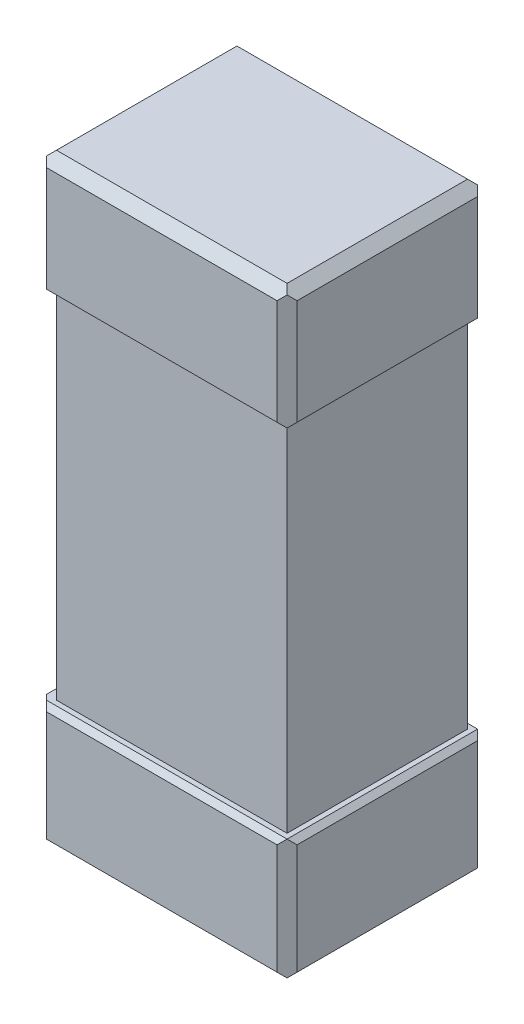
ISO-10303-21;
HEADER;
FILE_DESCRIPTION(('STEP AP214'),'2;1');
FILE_NAME('part.step','',(''),(''),'','','');
FILE_SCHEMA(('AUTOMOTIVE_DESIGN { 1 0 10303 214 1 1 1 1 }'));
ENDSEC;
DATA;
#1=APPLICATION_CONTEXT('core data for automotive mechanical design processes');
#2=APPLICATION_PROTOCOL_DEFINITION('international standard','automotive_design',2000,#1);
#3=PRODUCT_CONTEXT('',#1,'mechanical');
#4=PRODUCT('Part','Part','',(#3));
#5=PRODUCT_RELATED_PRODUCT_CATEGORY('part','',(#4));
#6=PRODUCT_DEFINITION_FORMATION('','',#4);
#7=PRODUCT_DEFINITION_CONTEXT('part definition',#1,'design');
#8=PRODUCT_DEFINITION('design','',#6,#7);
#9=PRODUCT_DEFINITION_SHAPE('','',#8);
#10=(LENGTH_UNIT() NAMED_UNIT(*) SI_UNIT(.MILLI.,.METRE.));
#11=(NAMED_UNIT(*) PLANE_ANGLE_UNIT() SI_UNIT($,.RADIAN.));
#12=(NAMED_UNIT(*) SI_UNIT($,.STERADIAN.) SOLID_ANGLE_UNIT());
#13=UNCERTAINTY_MEASURE_WITH_UNIT(LENGTH_MEASURE(1.E-05),#10,'distance_accuracy_value','');
#14=(GEOMETRIC_REPRESENTATION_CONTEXT(3) GLOBAL_UNCERTAINTY_ASSIGNED_CONTEXT((#13)) GLOBAL_UNIT_ASSIGNED_CONTEXT((#10,
#11,#12)) REPRESENTATION_CONTEXT('',''));
#15=CARTESIAN_POINT('',(0.,0.,0.));
#16=DIRECTION('',(0.,0.,1.));
#17=DIRECTION('',(1.,0.,0.));
#18=AXIS2_PLACEMENT_3D('',#15,#16,#17);
#19=CARTESIAN_POINT('',(-0.231,0.6,0.019));
#20=DIRECTION('',(0.,1.,0.));
#21=DIRECTION('',(0.,0.,1.));
#22=AXIS2_PLACEMENT_3D('',#19,#20,#21);
#23=PLANE('',#22);
#24=DIRECTION('',(1.,0.,0.));
#25=VECTOR('',#24,1.);
#26=CARTESIAN_POINT('',(0.,0.6,0.0199999999999999));
#27=LINE('',#26,#25);
#28=CARTESIAN_POINT('',(-0.23,0.6,0.0199999999999999));
#29=VERTEX_POINT('',#28);
#30=CARTESIAN_POINT('',(0.23,0.6,0.0200000000001649));
#31=VERTEX_POINT('',#30);
#32=EDGE_CURVE('E230',#29,#31,#27,.T.);
#33=ORIENTED_EDGE('',*,*,#32,.F.);
#34=DIRECTION('',(0.,0.,-1.));
#35=VECTOR('',#34,1.);
#36=CARTESIAN_POINT('',(-0.23,0.6,0.2));
#37=LINE('',#36,#35);
#38=CARTESIAN_POINT('',(-0.23,0.6,0.380000000000001));
#39=VERTEX_POINT('',#38);
#40=EDGE_CURVE('E267',#39,#29,#37,.T.);
#41=ORIENTED_EDGE('',*,*,#40,.F.);
#42=DIRECTION('',(-1.,0.,0.));
#43=VECTOR('',#42,1.);
#44=CARTESIAN_POINT('',(0.,0.6,0.380000000000001));
#45=LINE('',#44,#43);
#46=CARTESIAN_POINT('',(0.23,0.6,0.38));
#47=VERTEX_POINT('',#46);
#48=EDGE_CURVE('E263',#47,#39,#45,.T.);
#49=ORIENTED_EDGE('',*,*,#48,.F.);
#50=DIRECTION('',(0.,0.,1.));
#51=VECTOR('',#50,1.);
#52=CARTESIAN_POINT('',(0.23,0.6,0.19999999999989));
#53=LINE('',#52,#51);
#54=EDGE_CURVE('E233',#31,#47,#53,.T.);
#55=ORIENTED_EDGE('',*,*,#54,.F.);
#56=EDGE_LOOP('',(#33,#41,#49,#55));
#57=FACE_BOUND('',#56,.T.);
#58=ADVANCED_FACE('F16',(#57),#23,.T.);
#59=CARTESIAN_POINT('',(-0.24100000000011,0.600707106781242,0.0207071067812416));
#60=DIRECTION('',(0.,0.707106781186535,-0.70710678118656));
#61=DIRECTION('',(1.,0.,0.));
#62=AXIS2_PLACEMENT_3D('',#59,#60,#61);
#63=PLANE('',#62);
#64=DIRECTION('',(-0.577350269189625,0.577350269189627,0.577350269189626));
#65=VECTOR('',#64,1.);
#66=CARTESIAN_POINT('',(0.240000000000109,0.58999999999989,0.01000000000022));
#67=LINE('',#66,#65);
#68=CARTESIAN_POINT('',(0.240000000000041,0.589999999999835,0.0100000000000207));
#69=VERTEX_POINT('',#68);
#70=EDGE_CURVE('E20',#69,#31,#67,.T.);
#71=ORIENTED_EDGE('',*,*,#70,.F.);
#72=DIRECTION('',(0.577350269189637,0.577350269189626,0.577350269189615));
#73=VECTOR('',#72,1.);
#74=CARTESIAN_POINT('',(0.23,0.58,0.));
#75=LINE('',#74,#73);
#76=CARTESIAN_POINT('',(0.23,0.58,0.));
#77=VERTEX_POINT('',#76);
#78=EDGE_CURVE('E227',#77,#69,#75,.T.);
#79=ORIENTED_EDGE('',*,*,#78,.F.);
#80=DIRECTION('',(1.,0.,0.));
#81=VECTOR('',#80,1.);
#82=CARTESIAN_POINT('',(0.,0.58,0.));
#83=LINE('',#82,#81);
#84=CARTESIAN_POINT('',(-0.23,0.580000000000083,0.));
#85=VERTEX_POINT('',#84);
#86=EDGE_CURVE('E259',#85,#77,#83,.T.);
#87=ORIENTED_EDGE('',*,*,#86,.F.);
#88=DIRECTION('',(0.577350269189638,-0.577350269189622,-0.577350269189617));
#89=VECTOR('',#88,1.);
#90=CARTESIAN_POINT('',(-0.239999999999945,0.59000000000011,0.00999999999994501));
#91=LINE('',#90,#89);
#92=CARTESIAN_POINT('',(-0.239999999999959,0.590000000000041,0.00999999999995875));
#93=VERTEX_POINT('',#92);
#94=EDGE_CURVE('E253',#93,#85,#91,.T.);
#95=ORIENTED_EDGE('',*,*,#94,.F.);
#96=DIRECTION('',(-0.577350269189624,-0.577350269189624,-0.577350269189629));
#97=VECTOR('',#96,1.);
#98=CARTESIAN_POINT('',(-0.23,0.6,0.02));
#99=LINE('',#98,#97);
#100=EDGE_CURVE('E266',#29,#93,#99,.T.);
#101=ORIENTED_EDGE('',*,*,#100,.F.);
#102=ORIENTED_EDGE('',*,*,#32,.T.);
#103=EDGE_LOOP('',(#71,#79,#87,#95,#101,#102));
#104=FACE_BOUND('',#103,.T.);
#105=ADVANCED_FACE('F225',(#104),#63,.T.);
#106=CARTESIAN_POINT('',(0.229292893218813,0.600707106781186,0.00899999999978001));
#107=DIRECTION('',(0.707106781186548,0.707106781186547,0.));
#108=DIRECTION('',(0.,0.,1.));
#109=AXIS2_PLACEMENT_3D('',#106,#107,#108);
#110=PLANE('',#109);
#111=ORIENTED_EDGE('',*,*,#70,.T.);
#112=ORIENTED_EDGE('',*,*,#54,.T.);
#113=DIRECTION('',(-0.577350269189628,0.57735026918964,-0.577350269189609));
#114=VECTOR('',#113,1.);
#115=CARTESIAN_POINT('',(0.24,0.59,0.39));
#116=LINE('',#115,#114);
#117=CARTESIAN_POINT('',(0.24,0.59,0.39));
#118=VERTEX_POINT('',#117);
#119=EDGE_CURVE('E260',#118,#47,#116,.T.);
#120=ORIENTED_EDGE('',*,*,#119,.F.);
#121=DIRECTION('',(-0.577350269189641,0.577350269189623,0.577350269189613));
#122=VECTOR('',#121,1.);
#123=CARTESIAN_POINT('',(0.25,0.58,0.38));
#124=LINE('',#123,#122);
#125=CARTESIAN_POINT('',(0.25,0.58,0.38));
#126=VERTEX_POINT('',#125);
#127=EDGE_CURVE('E289',#126,#118,#124,.T.);
#128=ORIENTED_EDGE('',*,*,#127,.F.);
#129=DIRECTION('',(0.,0.,1.));
#130=VECTOR('',#129,1.);
#131=CARTESIAN_POINT('',(0.25,0.58,0.2));
#132=LINE('',#131,#130);
#133=CARTESIAN_POINT('',(0.25,0.579999999999918,0.02));
#134=VERTEX_POINT('',#133);
#135=EDGE_CURVE('E238',#134,#126,#132,.T.);
#136=ORIENTED_EDGE('',*,*,#135,.F.);
#137=DIRECTION('',(0.577350269189636,-0.577350269189627,0.577350269189615));
#138=VECTOR('',#137,1.);
#139=CARTESIAN_POINT('',(0.239999999999945,0.58999999999989,0.00999999999994507));
#140=LINE('',#139,#138);
#141=EDGE_CURVE('E235',#69,#134,#140,.T.);
#142=ORIENTED_EDGE('',*,*,#141,.F.);
#143=EDGE_LOOP('',(#111,#112,#120,#128,#136,#142));
#144=FACE_BOUND('',#143,.T.);
#145=ADVANCED_FACE('F236',(#144),#110,.T.);
#146=CARTESIAN_POINT('',(-0.250707106781187,0.579292893218813,0.00899999999999998));
#147=DIRECTION('',(-0.707106781186548,0.707106781186547,0.));
#148=DIRECTION('',(0.,0.,1.));
#149=AXIS2_PLACEMENT_3D('',#146,#147,#148);
#150=PLANE('',#149);
#151=ORIENTED_EDGE('',*,*,#100,.T.);
#152=DIRECTION('',(0.577350269189634,0.577350269189628,-0.577350269189616));
#153=VECTOR('',#152,1.);
#154=CARTESIAN_POINT('',(-0.25,0.58,0.0199999999999998));
#155=LINE('',#154,#153);
#156=CARTESIAN_POINT('',(-0.25,0.58,0.0199999999999998));
#157=VERTEX_POINT('',#156);
#158=EDGE_CURVE('E256',#157,#93,#155,.T.);
#159=ORIENTED_EDGE('',*,*,#158,.F.);
#160=DIRECTION('',(0.,0.,-1.));
#161=VECTOR('',#160,1.);
#162=CARTESIAN_POINT('',(-0.25,0.58,0.2));
#163=LINE('',#162,#161);
#164=CARTESIAN_POINT('',(-0.25,0.58,0.38));
#165=VERTEX_POINT('',#164);
#166=EDGE_CURVE('E279',#165,#157,#163,.T.);
#167=ORIENTED_EDGE('',*,*,#166,.F.);
#168=DIRECTION('',(-0.577350269189626,-0.577350269189627,-0.577350269189624));
#169=VECTOR('',#168,1.);
#170=CARTESIAN_POINT('',(-0.24,0.59,0.39));
#171=LINE('',#170,#169);
#172=CARTESIAN_POINT('',(-0.24,0.59,0.39));
#173=VERTEX_POINT('',#172);
#174=EDGE_CURVE('E299',#173,#165,#171,.T.);
#175=ORIENTED_EDGE('',*,*,#174,.F.);
#176=DIRECTION('',(-0.577350269189627,-0.577350269189641,0.57735026918961));
#177=VECTOR('',#176,1.);
#178=CARTESIAN_POINT('',(-0.23,0.600000000000001,0.380000000000001));
#179=LINE('',#178,#177);
#180=EDGE_CURVE('E264',#39,#173,#179,.T.);
#181=ORIENTED_EDGE('',*,*,#180,.F.);
#182=ORIENTED_EDGE('',*,*,#40,.T.);
#183=EDGE_LOOP('',(#151,#159,#167,#175,#181,#182));
#184=FACE_BOUND('',#183,.T.);
#185=ADVANCED_FACE('F530',(#184),#150,.T.);
#186=CARTESIAN_POINT('',(-0.241,0.579292893218813,0.400707106781187));
#187=DIRECTION('',(0.,0.70710678118653,0.707106781186565));
#188=DIRECTION('',(1.,0.,0.));
#189=AXIS2_PLACEMENT_3D('',#186,#187,#188);
#190=PLANE('',#189);
#191=ORIENTED_EDGE('',*,*,#119,.T.);
#192=ORIENTED_EDGE('',*,*,#48,.T.);
#193=ORIENTED_EDGE('',*,*,#180,.T.);
#194=DIRECTION('',(-0.577350269189624,0.577350269189628,-0.577350269189625));
#195=VECTOR('',#194,1.);
#196=CARTESIAN_POINT('',(-0.23,0.58,0.4));
#197=LINE('',#196,#195);
#198=CARTESIAN_POINT('',(-0.23,0.58,0.4));
#199=VERTEX_POINT('',#198);
#200=EDGE_CURVE('E303',#199,#173,#197,.T.);
#201=ORIENTED_EDGE('',*,*,#200,.F.);
#202=DIRECTION('',(-1.,0.,0.));
#203=VECTOR('',#202,1.);
#204=CARTESIAN_POINT('',(0.,0.58,0.4));
#205=LINE('',#204,#203);
#206=CARTESIAN_POINT('',(0.23,0.58,0.4));
#207=VERTEX_POINT('',#206);
#208=EDGE_CURVE('E293',#207,#199,#205,.T.);
#209=ORIENTED_EDGE('',*,*,#208,.F.);
#210=DIRECTION('',(-0.57735026918964,-0.577350269189625,0.577350269189612));
#211=VECTOR('',#210,1.);
#212=CARTESIAN_POINT('',(0.24,0.59,0.39));
#213=LINE('',#212,#211);
#214=EDGE_CURVE('E294',#118,#207,#213,.T.);
#215=ORIENTED_EDGE('',*,*,#214,.F.);
#216=EDGE_LOOP('',(#191,#192,#193,#201,#209,#215));
#217=FACE_BOUND('',#216,.T.);
#218=ADVANCED_FACE('F538',(#217),#190,.T.);
#219=CARTESIAN_POINT('',(-0.231,-0.6,0.381));
#220=DIRECTION('',(0.,-1.,0.));
#221=DIRECTION('',(0.,0.,-1.));
#222=AXIS2_PLACEMENT_3D('',#219,#220,#221);
#223=PLANE('',#222);
#224=DIRECTION('',(-1.,0.,0.));
#225=VECTOR('',#224,1.);
#226=CARTESIAN_POINT('',(0.,-0.6,0.0199999999999999));
#227=LINE('',#226,#225);
#228=CARTESIAN_POINT('',(0.230000000000083,-0.6,0.0199999999999999));
#229=VERTEX_POINT('',#228);
#230=CARTESIAN_POINT('',(-0.23,-0.6,0.02));
#231=VERTEX_POINT('',#230);
#232=EDGE_CURVE('E308',#229,#231,#227,.T.);
#233=ORIENTED_EDGE('',*,*,#232,.F.);
#234=DIRECTION('',(0.,0.,-1.));
#235=VECTOR('',#234,1.);
#236=CARTESIAN_POINT('',(0.23,-0.6,0.2));
#237=LINE('',#236,#235);
#238=CARTESIAN_POINT('',(0.23,-0.6,0.38));
#239=VERTEX_POINT('',#238);
#240=EDGE_CURVE('E278',#239,#229,#237,.T.);
#241=ORIENTED_EDGE('',*,*,#240,.F.);
#242=DIRECTION('',(1.,0.,0.));
#243=VECTOR('',#242,1.);
#244=CARTESIAN_POINT('',(0.,-0.600000000000001,0.38));
#245=LINE('',#244,#243);
#246=CARTESIAN_POINT('',(-0.23,-0.6,0.38));
#247=VERTEX_POINT('',#246);
#248=EDGE_CURVE('E315',#247,#239,#245,.T.);
#249=ORIENTED_EDGE('',*,*,#248,.F.);
#250=DIRECTION('',(0.,0.,1.));
#251=VECTOR('',#250,1.);
#252=CARTESIAN_POINT('',(-0.23,-0.6,0.2));
#253=LINE('',#252,#251);
#254=EDGE_CURVE('E312',#231,#247,#253,.T.);
#255=ORIENTED_EDGE('',*,*,#254,.F.);
#256=EDGE_LOOP('',(#233,#241,#249,#255));
#257=FACE_BOUND('',#256,.T.);
#258=ADVANCED_FACE('F650',(#257),#223,.T.);
#259=CARTESIAN_POINT('',(0.250707106781187,-0.579292893218814,0.00900000000000004));
#260=DIRECTION('',(0.707106781186532,-0.707106781186563,0.));
#261=DIRECTION('',(0.,0.,1.));
#262=AXIS2_PLACEMENT_3D('',#259,#260,#261);
#263=PLANE('',#262);
#264=DIRECTION('',(0.,0.,-1.));
#265=VECTOR('',#264,1.);
#266=CARTESIAN_POINT('',(0.25,-0.58,0.2));
#267=LINE('',#266,#265);
#268=CARTESIAN_POINT('',(0.25,-0.58,0.38));
#269=VERTEX_POINT('',#268);
#270=CARTESIAN_POINT('',(0.25,-0.58,0.02));
#271=VERTEX_POINT('',#270);
#272=EDGE_CURVE('E325',#269,#271,#267,.T.);
#273=ORIENTED_EDGE('',*,*,#272,.F.);
#274=DIRECTION('',(0.577350269189626,0.577350269189626,-0.577350269189626));
#275=VECTOR('',#274,1.);
#276=CARTESIAN_POINT('',(0.24,-0.59,0.39));
#277=LINE('',#276,#275);
#278=CARTESIAN_POINT('',(0.24,-0.59,0.39));
#279=VERTEX_POINT('',#278);
#280=EDGE_CURVE('E331',#279,#269,#277,.T.);
#281=ORIENTED_EDGE('',*,*,#280,.F.);
#282=DIRECTION('',(0.577350269189625,0.577350269189626,0.577350269189626));
#283=VECTOR('',#282,1.);
#284=CARTESIAN_POINT('',(0.23,-0.6,0.38));
#285=LINE('',#284,#283);
#286=EDGE_CURVE('E318',#239,#279,#285,.T.);
#287=ORIENTED_EDGE('',*,*,#286,.F.);
#288=ORIENTED_EDGE('',*,*,#240,.T.);
#289=DIRECTION('',(-0.577350269189628,-0.577350269189625,0.577350269189624));
#290=VECTOR('',#289,1.);
#291=CARTESIAN_POINT('',(0.24000000000011,-0.590000000000055,0.010000000000055));
#292=LINE('',#291,#290);
#293=CARTESIAN_POINT('',(0.239999999999979,-0.590000000000124,0.0100000000000001));
#294=VERTEX_POINT('',#293);
#295=EDGE_CURVE('E311',#294,#229,#292,.T.);
#296=ORIENTED_EDGE('',*,*,#295,.F.);
#297=DIRECTION('',(-0.577350269189633,-0.577350269189627,-0.577350269189618));
#298=VECTOR('',#297,1.);
#299=CARTESIAN_POINT('',(0.25,-0.58,0.02));
#300=LINE('',#299,#298);
#301=EDGE_CURVE('E334',#271,#294,#300,.T.);
#302=ORIENTED_EDGE('',*,*,#301,.F.);
#303=EDGE_LOOP('',(#273,#281,#287,#288,#296,#302));
#304=FACE_BOUND('',#303,.T.);
#305=ADVANCED_FACE('F647',(#304),#263,.T.);
#306=CARTESIAN_POINT('',(-0.25,0.369,0.019));
#307=DIRECTION('',(-1.,0.,0.));
#308=DIRECTION('',(0.,0.,1.));
#309=AXIS2_PLACEMENT_3D('',#306,#307,#308);
#310=PLANE('',#309);
#311=DIRECTION('',(0.,0.,-1.));
#312=VECTOR('',#311,1.);
#313=CARTESIAN_POINT('',(-0.25,0.37,0.2));
#314=LINE('',#313,#312);
#315=CARTESIAN_POINT('',(-0.25,0.37,0.38));
#316=VERTEX_POINT('',#315);
#317=CARTESIAN_POINT('',(-0.25,0.37,0.02));
#318=VERTEX_POINT('',#317);
#319=EDGE_CURVE('E337',#316,#318,#314,.T.);
#320=ORIENTED_EDGE('',*,*,#319,.F.);
#321=DIRECTION('',(0.,-1.,0.));
#322=VECTOR('',#321,1.);
#323=CARTESIAN_POINT('',(-0.25,0.475,0.38));
#324=LINE('',#323,#322);
#325=EDGE_CURVE('E304',#165,#316,#324,.T.);
#326=ORIENTED_EDGE('',*,*,#325,.F.);
#327=ORIENTED_EDGE('',*,*,#166,.T.);
#328=DIRECTION('',(0.,1.,0.));
#329=VECTOR('',#328,1.);
#330=CARTESIAN_POINT('',(-0.25,0.475000000000055,0.0199999999999999));
#331=LINE('',#330,#329);
#332=EDGE_CURVE('E246',#318,#157,#331,.T.);
#333=ORIENTED_EDGE('',*,*,#332,.F.);
#334=EDGE_LOOP('',(#320,#326,#327,#333));
#335=FACE_BOUND('',#334,.T.);
#336=ADVANCED_FACE('F533',(#335),#310,.T.);
#337=CARTESIAN_POINT('',(0.231,0.369,0.));
#338=DIRECTION('',(0.,0.,-1.));
#339=DIRECTION('',(-1.,0.,0.));
#340=AXIS2_PLACEMENT_3D('',#337,#338,#339);
#341=PLANE('',#340);
#342=DIRECTION('',(1.,0.,0.));
#343=VECTOR('',#342,1.);
#344=CARTESIAN_POINT('',(0.,0.37,0.));
#345=LINE('',#344,#343);
#346=CARTESIAN_POINT('',(-0.23,0.37,0.));
#347=VERTEX_POINT('',#346);
#348=CARTESIAN_POINT('',(0.23,0.37,0.));
#349=VERTEX_POINT('',#348);
#350=EDGE_CURVE('E356',#347,#349,#345,.T.);
#351=ORIENTED_EDGE('',*,*,#350,.F.);
#352=DIRECTION('',(0.,-1.,0.));
#353=VECTOR('',#352,1.);
#354=CARTESIAN_POINT('',(-0.23,0.475000000000055,0.));
#355=LINE('',#354,#353);
#356=EDGE_CURVE('E249',#85,#347,#355,.T.);
#357=ORIENTED_EDGE('',*,*,#356,.F.);
#358=ORIENTED_EDGE('',*,*,#86,.T.);
#359=DIRECTION('',(0.,1.,0.));
#360=VECTOR('',#359,1.);
#361=CARTESIAN_POINT('',(0.23,0.475,0.));
#362=LINE('',#361,#360);
#363=EDGE_CURVE('E241',#349,#77,#362,.T.);
#364=ORIENTED_EDGE('',*,*,#363,.F.);
#365=EDGE_LOOP('',(#351,#357,#358,#364));
#366=FACE_BOUND('',#365,.T.);
#367=ADVANCED_FACE('F529',(#366),#341,.T.);
#368=CARTESIAN_POINT('',(-0.250707106781187,0.359,0.0207071067811867));
#369=DIRECTION('',(-0.707106781186535,0.,-0.70710678118656));
#370=DIRECTION('',(0.,1.,0.));
#371=AXIS2_PLACEMENT_3D('',#368,#369,#370);
#372=PLANE('',#371);
#373=DIRECTION('',(0.577350269189638,-0.57735026918961,-0.577350269189629));
#374=VECTOR('',#373,1.);
#375=CARTESIAN_POINT('',(-0.25,0.37,0.0200000000000001));
#376=LINE('',#375,#374);
#377=CARTESIAN_POINT('',(-0.24,0.36,0.00999999999999996));
#378=VERTEX_POINT('',#377);
#379=EDGE_CURVE('E344',#318,#378,#376,.T.);
#380=ORIENTED_EDGE('',*,*,#379,.F.);
#381=ORIENTED_EDGE('',*,*,#332,.T.);
#382=ORIENTED_EDGE('',*,*,#158,.T.);
#383=ORIENTED_EDGE('',*,*,#94,.T.);
#384=ORIENTED_EDGE('',*,*,#356,.T.);
#385=DIRECTION('',(0.577350269189626,0.577350269189635,-0.577350269189617));
#386=VECTOR('',#385,1.);
#387=CARTESIAN_POINT('',(-0.24,0.36,0.01));
#388=LINE('',#387,#386);
#389=EDGE_CURVE('E468',#378,#347,#388,.T.);
#390=ORIENTED_EDGE('',*,*,#389,.F.);
#391=EDGE_LOOP('',(#380,#381,#382,#383,#384,#390));
#392=FACE_BOUND('',#391,.T.);
#393=ADVANCED_FACE('F526',(#392),#372,.T.);
#394=CARTESIAN_POINT('',(0.229292893218813,0.359,-0.00070710678118641));
#395=DIRECTION('',(0.707106781186535,0.,-0.70710678118656));
#396=DIRECTION('',(0.,1.,0.));
#397=AXIS2_PLACEMENT_3D('',#394,#395,#396);
#398=PLANE('',#397);
#399=DIRECTION('',(0.577350269189626,-0.577350269189635,0.577350269189616));
#400=VECTOR('',#399,1.);
#401=CARTESIAN_POINT('',(0.23,0.37,0.));
#402=LINE('',#401,#400);
#403=CARTESIAN_POINT('',(0.240000000000083,0.360000000000082,0.0100000000000826));
#404=VERTEX_POINT('',#403);
#405=EDGE_CURVE('E359',#349,#404,#402,.T.);
#406=ORIENTED_EDGE('',*,*,#405,.F.);
#407=ORIENTED_EDGE('',*,*,#363,.T.);
#408=ORIENTED_EDGE('',*,*,#78,.T.);
#409=ORIENTED_EDGE('',*,*,#141,.T.);
#410=DIRECTION('',(0.,1.,0.));
#411=VECTOR('',#410,1.);
#412=CARTESIAN_POINT('',(0.25,0.475,0.0200000000000001));
#413=LINE('',#412,#411);
#414=CARTESIAN_POINT('',(0.25,0.37,0.02));
#415=VERTEX_POINT('',#414);
#416=EDGE_CURVE('E287',#415,#134,#413,.T.);
#417=ORIENTED_EDGE('',*,*,#416,.F.);
#418=DIRECTION('',(0.577350269189638,0.577350269189614,0.577350269189626));
#419=VECTOR('',#418,1.);
#420=CARTESIAN_POINT('',(0.24,0.36,0.00999999999999998));
#421=LINE('',#420,#419);
#422=EDGE_CURVE('E365',#404,#415,#421,.T.);
#423=ORIENTED_EDGE('',*,*,#422,.F.);
#424=EDGE_LOOP('',(#406,#407,#408,#409,#417,#423));
#425=FACE_BOUND('',#424,.T.);
#426=ADVANCED_FACE('F245',(#425),#398,.T.);
#427=CARTESIAN_POINT('',(0.25,0.369,0.381));
#428=DIRECTION('',(1.,0.,0.));
#429=DIRECTION('',(0.,0.,-1.));
#430=AXIS2_PLACEMENT_3D('',#427,#428,#429);
#431=PLANE('',#430);
#432=DIRECTION('',(0.,0.,1.));
#433=VECTOR('',#432,1.);
#434=CARTESIAN_POINT('',(0.25,0.37,0.2));
#435=LINE('',#434,#433);
#436=CARTESIAN_POINT('',(0.25,0.370000000000001,0.38));
#437=VERTEX_POINT('',#436);
#438=EDGE_CURVE('E361',#415,#437,#435,.T.);
#439=ORIENTED_EDGE('',*,*,#438,.F.);
#440=ORIENTED_EDGE('',*,*,#416,.T.);
#441=ORIENTED_EDGE('',*,*,#135,.T.);
#442=DIRECTION('',(0.,1.,0.));
#443=VECTOR('',#442,1.);
#444=CARTESIAN_POINT('',(0.25,0.475,0.38));
#445=LINE('',#444,#443);
#446=EDGE_CURVE('E290',#437,#126,#445,.T.);
#447=ORIENTED_EDGE('',*,*,#446,.F.);
#448=EDGE_LOOP('',(#439,#440,#441,#447));
#449=FACE_BOUND('',#448,.T.);
#450=ADVANCED_FACE('F503',(#449),#431,.T.);
#451=CARTESIAN_POINT('',(0.250707106781187,0.359,0.379292893218814));
#452=DIRECTION('',(0.70710678118653,0.,0.707106781186565));
#453=DIRECTION('',(0.,1.,0.));
#454=AXIS2_PLACEMENT_3D('',#451,#452,#453);
#455=PLANE('',#454);
#456=DIRECTION('',(-0.577350269189641,-0.577350269189612,0.577350269189624));
#457=VECTOR('',#456,1.);
#458=CARTESIAN_POINT('',(0.25,0.37,0.38));
#459=LINE('',#458,#457);
#460=CARTESIAN_POINT('',(0.24,0.36,0.39));
#461=VERTEX_POINT('',#460);
#462=EDGE_CURVE('E364',#437,#461,#459,.T.);
#463=ORIENTED_EDGE('',*,*,#462,.F.);
#464=ORIENTED_EDGE('',*,*,#446,.T.);
#465=ORIENTED_EDGE('',*,*,#127,.T.);
#466=ORIENTED_EDGE('',*,*,#214,.T.);
#467=DIRECTION('',(0.,1.,0.));
#468=VECTOR('',#467,1.);
#469=CARTESIAN_POINT('',(0.23,0.475,0.4));
#470=LINE('',#469,#468);
#471=CARTESIAN_POINT('',(0.23,0.37,0.4));
#472=VERTEX_POINT('',#471);
#473=EDGE_CURVE('E296',#472,#207,#470,.T.);
#474=ORIENTED_EDGE('',*,*,#473,.F.);
#475=DIRECTION('',(-0.577350269189628,0.577350269189639,0.577350269189611));
#476=VECTOR('',#475,1.);
#477=CARTESIAN_POINT('',(0.24,0.36,0.39));
#478=LINE('',#477,#476);
#479=EDGE_CURVE('E375',#461,#472,#478,.T.);
#480=ORIENTED_EDGE('',*,*,#479,.F.);
#481=EDGE_LOOP('',(#463,#464,#465,#466,#474,#480));
#482=FACE_BOUND('',#481,.T.);
#483=ADVANCED_FACE('F499',(#482),#455,.T.);
#484=CARTESIAN_POINT('',(-0.231,0.369,0.4));
#485=DIRECTION('',(0.,0.,1.));
#486=DIRECTION('',(1.,0.,0.));
#487=AXIS2_PLACEMENT_3D('',#484,#485,#486);
#488=PLANE('',#487);
#489=DIRECTION('',(-1.,0.,0.));
#490=VECTOR('',#489,1.);
#491=CARTESIAN_POINT('',(0.,0.37,0.4));
#492=LINE('',#491,#490);
#493=CARTESIAN_POINT('',(-0.23,0.37,0.4));
#494=VERTEX_POINT('',#493);
#495=EDGE_CURVE('E371',#472,#494,#492,.T.);
#496=ORIENTED_EDGE('',*,*,#495,.F.);
#497=ORIENTED_EDGE('',*,*,#473,.T.);
#498=ORIENTED_EDGE('',*,*,#208,.T.);
#499=DIRECTION('',(0.,1.,0.));
#500=VECTOR('',#499,1.);
#501=CARTESIAN_POINT('',(-0.23,0.475,0.4));
#502=LINE('',#501,#500);
#503=EDGE_CURVE('E300',#494,#199,#502,.T.);
#504=ORIENTED_EDGE('',*,*,#503,.F.);
#505=EDGE_LOOP('',(#496,#497,#498,#504));
#506=FACE_BOUND('',#505,.T.);
#507=ADVANCED_FACE('F631',(#506),#488,.T.);
#508=CARTESIAN_POINT('',(-0.250707106781187,0.591,0.379292893218813));
#509=DIRECTION('',(-0.707106781186547,0.,0.707106781186547));
#510=DIRECTION('',(0.,-1.,0.));
#511=AXIS2_PLACEMENT_3D('',#508,#509,#510);
#512=PLANE('',#511);
#513=ORIENTED_EDGE('',*,*,#503,.T.);
#514=ORIENTED_EDGE('',*,*,#200,.T.);
#515=ORIENTED_EDGE('',*,*,#174,.T.);
#516=ORIENTED_EDGE('',*,*,#325,.T.);
#517=DIRECTION('',(-0.57735026918964,0.577350269189609,-0.577350269189628));
#518=VECTOR('',#517,1.);
#519=CARTESIAN_POINT('',(-0.24,0.36,0.39));
#520=LINE('',#519,#518);
#521=CARTESIAN_POINT('',(-0.24,0.36,0.39));
#522=VERTEX_POINT('',#521);
#523=EDGE_CURVE('E360',#522,#316,#520,.T.);
#524=ORIENTED_EDGE('',*,*,#523,.F.);
#525=DIRECTION('',(-0.577350269189627,-0.577350269189639,-0.577350269189611));
#526=VECTOR('',#525,1.);
#527=CARTESIAN_POINT('',(-0.23,0.37,0.4));
#528=LINE('',#527,#526);
#529=EDGE_CURVE('E374',#494,#522,#528,.T.);
#530=ORIENTED_EDGE('',*,*,#529,.F.);
#531=EDGE_LOOP('',(#513,#514,#515,#516,#524,#530));
#532=FACE_BOUND('',#531,.T.);
#533=ADVANCED_FACE('F535',(#532),#512,.T.);
#534=CARTESIAN_POINT('',(-0.241,-0.579292893218759,-0.000707106781241251));
#535=DIRECTION('',(0.,-0.707106781186547,-0.707106781186548));
#536=DIRECTION('',(1.,0.,0.));
#537=AXIS2_PLACEMENT_3D('',#534,#535,#536);
#538=PLANE('',#537);
#539=DIRECTION('',(0.577350269189638,-0.577350269189615,0.577350269189624));
#540=VECTOR('',#539,1.);
#541=CARTESIAN_POINT('',(-0.24,-0.59,0.01));
#542=LINE('',#541,#540);
#543=CARTESIAN_POINT('',(-0.240000000000041,-0.590000000000041,0.010000000000041));
#544=VERTEX_POINT('',#543);
#545=EDGE_CURVE('E310',#544,#231,#542,.T.);
#546=ORIENTED_EDGE('',*,*,#545,.F.);
#547=DIRECTION('',(-0.577350269189624,-0.577350269189632,0.577350269189622));
#548=VECTOR('',#547,1.);
#549=CARTESIAN_POINT('',(-0.23,-0.58,0.));
#550=LINE('',#549,#548);
#551=CARTESIAN_POINT('',(-0.23,-0.58,0.));
#552=VERTEX_POINT('',#551);
#553=EDGE_CURVE('E386',#552,#544,#550,.T.);
#554=ORIENTED_EDGE('',*,*,#553,.F.);
#555=DIRECTION('',(-1.,0.,0.));
#556=VECTOR('',#555,1.);
#557=CARTESIAN_POINT('',(0.,-0.58,0.));
#558=LINE('',#557,#556);
#559=CARTESIAN_POINT('',(0.23,-0.580000000000083,0.));
#560=VERTEX_POINT('',#559);
#561=EDGE_CURVE('E335',#560,#552,#558,.T.);
#562=ORIENTED_EDGE('',*,*,#561,.F.);
#563=DIRECTION('',(-0.577350269189632,0.577350269189627,-0.577350269189618));
#564=VECTOR('',#563,1.);
#565=CARTESIAN_POINT('',(0.239999999999945,-0.59000000000011,0.00999999999994506));
#566=LINE('',#565,#564);
#567=EDGE_CURVE('E341',#294,#560,#566,.T.);
#568=ORIENTED_EDGE('',*,*,#567,.F.);
#569=ORIENTED_EDGE('',*,*,#295,.T.);
#570=ORIENTED_EDGE('',*,*,#232,.T.);
#571=EDGE_LOOP('',(#546,#554,#562,#568,#569,#570));
#572=FACE_BOUND('',#571,.T.);
#573=ADVANCED_FACE('F624',(#572),#538,.T.);
#574=CARTESIAN_POINT('',(-0.250707106781187,-0.579292893218813,0.391));
#575=DIRECTION('',(-0.707106781186532,-0.707106781186563,0.));
#576=DIRECTION('',(0.,0.,-1.));
#577=AXIS2_PLACEMENT_3D('',#574,#575,#576);
#578=PLANE('',#577);
#579=DIRECTION('',(0.577350269189629,-0.577350269189623,-0.577350269189626));
#580=VECTOR('',#579,1.);
#581=CARTESIAN_POINT('',(-0.24,-0.59,0.39));
#582=LINE('',#581,#580);
#583=CARTESIAN_POINT('',(-0.24,-0.59,0.39));
#584=VERTEX_POINT('',#583);
#585=EDGE_CURVE('E314',#584,#247,#582,.T.);
#586=ORIENTED_EDGE('',*,*,#585,.F.);
#587=DIRECTION('',(0.57735026918964,-0.577350269189626,0.577350269189611));
#588=VECTOR('',#587,1.);
#589=CARTESIAN_POINT('',(-0.25,-0.58,0.380000000000001));
#590=LINE('',#589,#588);
#591=CARTESIAN_POINT('',(-0.25,-0.58,0.380000000000001));
#592=VERTEX_POINT('',#591);
#593=EDGE_CURVE('E397',#592,#584,#590,.T.);
#594=ORIENTED_EDGE('',*,*,#593,.F.);
#595=DIRECTION('',(0.,0.,1.));
#596=VECTOR('',#595,1.);
#597=CARTESIAN_POINT('',(-0.25,-0.58,0.2));
#598=LINE('',#597,#596);
#599=CARTESIAN_POINT('',(-0.25,-0.580000000000083,0.0200000000000001));
#600=VERTEX_POINT('',#599);
#601=EDGE_CURVE('E387',#600,#592,#598,.T.);
#602=ORIENTED_EDGE('',*,*,#601,.F.);
#603=DIRECTION('',(-0.57735026918963,0.577350269189622,0.577350269189626));
#604=VECTOR('',#603,1.);
#605=CARTESIAN_POINT('',(-0.240000000000055,-0.59000000000011,0.0100000000000549));
#606=LINE('',#605,#604);
#607=EDGE_CURVE('E390',#544,#600,#606,.T.);
#608=ORIENTED_EDGE('',*,*,#607,.F.);
#609=ORIENTED_EDGE('',*,*,#545,.T.);
#610=ORIENTED_EDGE('',*,*,#254,.T.);
#611=EDGE_LOOP('',(#586,#594,#602,#608,#609,#610));
#612=FACE_BOUND('',#611,.T.);
#613=ADVANCED_FACE('F620',(#612),#578,.T.);
#614=CARTESIAN_POINT('',(0.241,-0.579292893218813,0.400707106781187));
#615=DIRECTION('',(0.,-0.707106781186547,0.707106781186548));
#616=DIRECTION('',(-1.,0.,0.));
#617=AXIS2_PLACEMENT_3D('',#614,#615,#616);
#618=PLANE('',#617);
#619=DIRECTION('',(1.,0.,0.));
#620=VECTOR('',#619,1.);
#621=CARTESIAN_POINT('',(0.,-0.58,0.4));
#622=LINE('',#621,#620);
#623=CARTESIAN_POINT('',(-0.23,-0.58,0.4));
#624=VERTEX_POINT('',#623);
#625=CARTESIAN_POINT('',(0.23,-0.58,0.4));
#626=VERTEX_POINT('',#625);
#627=EDGE_CURVE('E319',#624,#626,#622,.T.);
#628=ORIENTED_EDGE('',*,*,#627,.F.);
#629=DIRECTION('',(0.577350269189638,0.577350269189627,0.577350269189612));
#630=VECTOR('',#629,1.);
#631=CARTESIAN_POINT('',(-0.24,-0.59,0.39));
#632=LINE('',#631,#630);
#633=EDGE_CURVE('E443',#584,#624,#632,.T.);
#634=ORIENTED_EDGE('',*,*,#633,.F.);
#635=ORIENTED_EDGE('',*,*,#585,.T.);
#636=ORIENTED_EDGE('',*,*,#248,.T.);
#637=ORIENTED_EDGE('',*,*,#286,.T.);
#638=DIRECTION('',(0.577350269189625,-0.577350269189628,-0.577350269189625));
#639=VECTOR('',#638,1.);
#640=CARTESIAN_POINT('',(0.23,-0.58,0.4));
#641=LINE('',#640,#639);
#642=EDGE_CURVE('E324',#626,#279,#641,.T.);
#643=ORIENTED_EDGE('',*,*,#642,.F.);
#644=EDGE_LOOP('',(#628,#634,#635,#636,#637,#643));
#645=FACE_BOUND('',#644,.T.);
#646=ADVANCED_FACE('F616',(#645),#618,.T.);
#647=CARTESIAN_POINT('',(-0.231,-0.581,0.4));
#648=DIRECTION('',(0.,0.,1.));
#649=DIRECTION('',(1.,0.,0.));
#650=AXIS2_PLACEMENT_3D('',#647,#648,#649);
#651=PLANE('',#650);
#652=DIRECTION('',(0.,-1.,0.));
#653=VECTOR('',#652,1.);
#654=CARTESIAN_POINT('',(0.23,-0.47,0.4));
#655=LINE('',#654,#653);
#656=CARTESIAN_POINT('',(0.23,-0.36,0.4));
#657=VERTEX_POINT('',#656);
#658=EDGE_CURVE('E321',#657,#626,#655,.T.);
#659=ORIENTED_EDGE('',*,*,#658,.F.);
#660=DIRECTION('',(1.,0.,0.));
#661=VECTOR('',#660,1.);
#662=CARTESIAN_POINT('',(0.,-0.36,0.4));
#663=LINE('',#662,#661);
#664=CARTESIAN_POINT('',(-0.23,-0.36,0.4));
#665=VERTEX_POINT('',#664);
#666=EDGE_CURVE('E399',#665,#657,#663,.T.);
#667=ORIENTED_EDGE('',*,*,#666,.F.);
#668=DIRECTION('',(0.,1.,0.));
#669=VECTOR('',#668,1.);
#670=CARTESIAN_POINT('',(-0.23,-0.47,0.4));
#671=LINE('',#670,#669);
#672=EDGE_CURVE('E393',#624,#665,#671,.T.);
#673=ORIENTED_EDGE('',*,*,#672,.F.);
#674=ORIENTED_EDGE('',*,*,#627,.T.);
#675=EDGE_LOOP('',(#659,#667,#673,#674));
#676=FACE_BOUND('',#675,.T.);
#677=ADVANCED_FACE('F612',(#676),#651,.T.);
#678=CARTESIAN_POINT('',(0.229292893218813,-0.349,0.400707106781187));
#679=DIRECTION('',(0.707106781186547,0.,0.707106781186547));
#680=DIRECTION('',(0.,-1.,0.));
#681=AXIS2_PLACEMENT_3D('',#678,#679,#680);
#682=PLANE('',#681);
#683=ORIENTED_EDGE('',*,*,#642,.T.);
#684=ORIENTED_EDGE('',*,*,#280,.T.);
#685=DIRECTION('',(0.,-1.,0.));
#686=VECTOR('',#685,1.);
#687=CARTESIAN_POINT('',(0.25,-0.47,0.38));
#688=LINE('',#687,#686);
#689=CARTESIAN_POINT('',(0.25,-0.36,0.38));
#690=VERTEX_POINT('',#689);
#691=EDGE_CURVE('E328',#690,#269,#688,.T.);
#692=ORIENTED_EDGE('',*,*,#691,.F.);
#693=DIRECTION('',(0.57735026918965,-0.577350269189603,-0.577350269189625));
#694=VECTOR('',#693,1.);
#695=CARTESIAN_POINT('',(0.24,-0.35,0.39));
#696=LINE('',#695,#694);
#697=CARTESIAN_POINT('',(0.24,-0.35,0.39));
#698=VERTEX_POINT('',#697);
#699=EDGE_CURVE('E416',#698,#690,#696,.T.);
#700=ORIENTED_EDGE('',*,*,#699,.F.);
#701=DIRECTION('',(0.577350269189632,0.577350269189623,-0.577350269189623));
#702=VECTOR('',#701,1.);
#703=CARTESIAN_POINT('',(0.23,-0.36,0.4));
#704=LINE('',#703,#702);
#705=EDGE_CURVE('E402',#657,#698,#704,.T.);
#706=ORIENTED_EDGE('',*,*,#705,.F.);
#707=ORIENTED_EDGE('',*,*,#658,.T.);
#708=EDGE_LOOP('',(#683,#684,#692,#700,#706,#707));
#709=FACE_BOUND('',#708,.T.);
#710=ADVANCED_FACE('F608',(#709),#682,.T.);
#711=CARTESIAN_POINT('',(0.25,-0.581,0.381));
#712=DIRECTION('',(1.,0.,0.));
#713=DIRECTION('',(0.,0.,-1.));
#714=AXIS2_PLACEMENT_3D('',#711,#712,#713);
#715=PLANE('',#714);
#716=DIRECTION('',(0.,-1.,0.));
#717=VECTOR('',#716,1.);
#718=CARTESIAN_POINT('',(0.25,-0.47,0.0199999999999999));
#719=LINE('',#718,#717);
#720=CARTESIAN_POINT('',(0.25,-0.36,0.0200000000001649));
#721=VERTEX_POINT('',#720);
#722=EDGE_CURVE('E327',#721,#271,#719,.T.);
#723=ORIENTED_EDGE('',*,*,#722,.F.);
#724=DIRECTION('',(0.,0.,-1.));
#725=VECTOR('',#724,1.);
#726=CARTESIAN_POINT('',(0.25,-0.36,0.2));
#727=LINE('',#726,#725);
#728=EDGE_CURVE('E412',#690,#721,#727,.T.);
#729=ORIENTED_EDGE('',*,*,#728,.F.);
#730=ORIENTED_EDGE('',*,*,#691,.T.);
#731=ORIENTED_EDGE('',*,*,#272,.T.);
#732=EDGE_LOOP('',(#723,#729,#730,#731));
#733=FACE_BOUND('',#732,.T.);
#734=ADVANCED_FACE('F604',(#733),#715,.T.);
#735=CARTESIAN_POINT('',(0.250707106781242,-0.348999999999889,0.0207071067812416));
#736=DIRECTION('',(0.707106781186538,0.,-0.707106781186557));
#737=DIRECTION('',(0.,-1.,0.));
#738=AXIS2_PLACEMENT_3D('',#735,#736,#737);
#739=PLANE('',#738);
#740=ORIENTED_EDGE('',*,*,#301,.T.);
#741=ORIENTED_EDGE('',*,*,#567,.T.);
#742=DIRECTION('',(0.,-1.,0.));
#743=VECTOR('',#742,1.);
#744=CARTESIAN_POINT('',(0.23,-0.47,0.));
#745=LINE('',#744,#743);
#746=CARTESIAN_POINT('',(0.230000000000083,-0.36,0.));
#747=VERTEX_POINT('',#746);
#748=EDGE_CURVE('E338',#747,#560,#745,.T.);
#749=ORIENTED_EDGE('',*,*,#748,.F.);
#750=DIRECTION('',(-0.577350269189629,-0.57735026918961,-0.577350269189638));
#751=VECTOR('',#750,1.);
#752=CARTESIAN_POINT('',(0.240000000000111,-0.350000000000056,0.009999999999945));
#753=LINE('',#752,#751);
#754=CARTESIAN_POINT('',(0.240000000000021,-0.350000000000021,0.0100000000001238));
#755=VERTEX_POINT('',#754);
#756=EDGE_CURVE('E423',#755,#747,#753,.T.);
#757=ORIENTED_EDGE('',*,*,#756,.F.);
#758=DIRECTION('',(-0.577350269189652,0.577350269189599,-0.577350269189626));
#759=VECTOR('',#758,1.);
#760=CARTESIAN_POINT('',(0.24999999999989,-0.35999999999989,0.02000000000022));
#761=LINE('',#760,#759);
#762=EDGE_CURVE('E415',#721,#755,#761,.T.);
#763=ORIENTED_EDGE('',*,*,#762,.F.);
#764=ORIENTED_EDGE('',*,*,#722,.T.);
#765=EDGE_LOOP('',(#740,#741,#749,#757,#763,#764));
#766=FACE_BOUND('',#765,.T.);
#767=ADVANCED_FACE('F600',(#766),#739,.T.);
#768=CARTESIAN_POINT('',(0.231,-0.581,0.));
#769=DIRECTION('',(0.,0.,-1.));
#770=DIRECTION('',(-1.,0.,0.));
#771=AXIS2_PLACEMENT_3D('',#768,#769,#770);
#772=PLANE('',#771);
#773=ORIENTED_EDGE('',*,*,#748,.T.);
#774=ORIENTED_EDGE('',*,*,#561,.T.);
#775=DIRECTION('',(0.,-1.,0.));
#776=VECTOR('',#775,1.);
#777=CARTESIAN_POINT('',(-0.23,-0.470000000000055,0.));
#778=LINE('',#777,#776);
#779=CARTESIAN_POINT('',(-0.23,-0.36,0.));
#780=VERTEX_POINT('',#779);
#781=EDGE_CURVE('E383',#780,#552,#778,.T.);
#782=ORIENTED_EDGE('',*,*,#781,.F.);
#783=DIRECTION('',(-1.,0.,0.));
#784=VECTOR('',#783,1.);
#785=CARTESIAN_POINT('',(0.,-0.36,0.));
#786=LINE('',#785,#784);
#787=EDGE_CURVE('E420',#747,#780,#786,.T.);
#788=ORIENTED_EDGE('',*,*,#787,.F.);
#789=EDGE_LOOP('',(#773,#774,#782,#788));
#790=FACE_BOUND('',#789,.T.);
#791=ADVANCED_FACE('F597',(#790),#772,.T.);
#792=CARTESIAN_POINT('',(-0.250707106781187,0.370707106781187,0.391));
#793=DIRECTION('',(-0.70710678118653,-0.707106781186565,0.));
#794=DIRECTION('',(0.,0.,-1.));
#795=AXIS2_PLACEMENT_3D('',#792,#793,#794);
#796=PLANE('',#795);
#797=DIRECTION('',(0.57735026918963,-0.577350269189639,-0.577350269189608));
#798=VECTOR('',#797,1.);
#799=CARTESIAN_POINT('',(-0.24,0.36,0.39));
#800=LINE('',#799,#798);
#801=CARTESIAN_POINT('',(-0.23,0.35,0.38));
#802=VERTEX_POINT('',#801);
#803=EDGE_CURVE('E459',#522,#802,#800,.T.);
#804=ORIENTED_EDGE('',*,*,#803,.F.);
#805=ORIENTED_EDGE('',*,*,#523,.T.);
#806=ORIENTED_EDGE('',*,*,#319,.T.);
#807=ORIENTED_EDGE('',*,*,#379,.T.);
#808=DIRECTION('',(-0.577350269189628,0.577350269189634,-0.577350269189616));
#809=VECTOR('',#808,1.);
#810=CARTESIAN_POINT('',(-0.23,0.35,0.0199999999999999));
#811=LINE('',#810,#809);
#812=CARTESIAN_POINT('',(-0.23,0.35,0.0199999999999999));
#813=VERTEX_POINT('',#812);
#814=EDGE_CURVE('E471',#813,#378,#811,.T.);
#815=ORIENTED_EDGE('',*,*,#814,.F.);
#816=DIRECTION('',(0.,0.,-1.));
#817=VECTOR('',#816,1.);
#818=CARTESIAN_POINT('',(-0.23,0.35,0.2));
#819=LINE('',#818,#817);
#820=EDGE_CURVE('E345',#802,#813,#819,.T.);
#821=ORIENTED_EDGE('',*,*,#820,.F.);
#822=EDGE_LOOP('',(#804,#805,#806,#807,#815,#821));
#823=FACE_BOUND('',#822,.T.);
#824=ADVANCED_FACE('F522',(#823),#796,.T.);
#825=CARTESIAN_POINT('',(-0.241,0.370707106781187,-0.000707106781186553));
#826=DIRECTION('',(0.,-0.707106781186536,-0.707106781186559));
#827=DIRECTION('',(1.,0.,0.));
#828=AXIS2_PLACEMENT_3D('',#825,#826,#827);
#829=PLANE('',#828);
#830=ORIENTED_EDGE('',*,*,#814,.T.);
#831=ORIENTED_EDGE('',*,*,#389,.T.);
#832=ORIENTED_EDGE('',*,*,#350,.T.);
#833=ORIENTED_EDGE('',*,*,#405,.T.);
#834=DIRECTION('',(0.577350269189642,0.577350269189612,-0.577350269189624));
#835=VECTOR('',#834,1.);
#836=CARTESIAN_POINT('',(0.23000000000011,0.35000000000011,0.02000000000022));
#837=LINE('',#836,#835);
#838=CARTESIAN_POINT('',(0.23,0.35,0.020000000000165));
#839=VERTEX_POINT('',#838);
#840=EDGE_CURVE('E465',#839,#404,#837,.T.);
#841=ORIENTED_EDGE('',*,*,#840,.F.);
#842=DIRECTION('',(1.,0.,0.));
#843=VECTOR('',#842,1.);
#844=CARTESIAN_POINT('',(0.,0.35,0.02));
#845=LINE('',#844,#843);
#846=EDGE_CURVE('E350',#813,#839,#845,.T.);
#847=ORIENTED_EDGE('',*,*,#846,.F.);
#848=EDGE_LOOP('',(#830,#831,#832,#833,#841,#847));
#849=FACE_BOUND('',#848,.T.);
#850=ADVANCED_FACE('F510',(#849),#829,.T.);
#851=CARTESIAN_POINT('',(0.250707106781187,0.370707106781186,0.00899999999999991));
#852=DIRECTION('',(0.70710678118653,-0.707106781186565,0.));
#853=DIRECTION('',(0.,0.,1.));
#854=AXIS2_PLACEMENT_3D('',#851,#852,#853);
#855=PLANE('',#854);
#856=ORIENTED_EDGE('',*,*,#438,.T.);
#857=ORIENTED_EDGE('',*,*,#462,.T.);
#858=DIRECTION('',(0.577350269189626,0.57735026918964,0.577350269189612));
#859=VECTOR('',#858,1.);
#860=CARTESIAN_POINT('',(0.23,0.35,0.380000000000001));
#861=LINE('',#860,#859);
#862=CARTESIAN_POINT('',(0.23,0.35,0.380000000000001));
#863=VERTEX_POINT('',#862);
#864=EDGE_CURVE('E456',#863,#461,#861,.T.);
#865=ORIENTED_EDGE('',*,*,#864,.F.);
#866=DIRECTION('',(0.,0.,1.));
#867=VECTOR('',#866,1.);
#868=CARTESIAN_POINT('',(0.23,0.35,0.2));
#869=LINE('',#868,#867);
#870=EDGE_CURVE('E366',#839,#863,#869,.T.);
#871=ORIENTED_EDGE('',*,*,#870,.F.);
#872=ORIENTED_EDGE('',*,*,#840,.T.);
#873=ORIENTED_EDGE('',*,*,#422,.T.);
#874=EDGE_LOOP('',(#856,#857,#865,#871,#872,#873));
#875=FACE_BOUND('',#874,.T.);
#876=ADVANCED_FACE('F507',(#875),#855,.T.);
#877=CARTESIAN_POINT('',(0.241,0.370707106781187,0.400707106781187));
#878=DIRECTION('',(0.,-0.70710678118653,0.707106781186565));
#879=DIRECTION('',(-1.,0.,0.));
#880=AXIS2_PLACEMENT_3D('',#877,#878,#879);
#881=PLANE('',#880);
#882=ORIENTED_EDGE('',*,*,#495,.T.);
#883=ORIENTED_EDGE('',*,*,#529,.T.);
#884=ORIENTED_EDGE('',*,*,#803,.T.);
#885=DIRECTION('',(-1.,0.,0.));
#886=VECTOR('',#885,1.);
#887=CARTESIAN_POINT('',(0.,0.35,0.38));
#888=LINE('',#887,#886);
#889=EDGE_CURVE('E378',#863,#802,#888,.T.);
#890=ORIENTED_EDGE('',*,*,#889,.F.);
#891=ORIENTED_EDGE('',*,*,#864,.T.);
#892=ORIENTED_EDGE('',*,*,#479,.T.);
#893=EDGE_LOOP('',(#882,#883,#884,#890,#891,#892));
#894=FACE_BOUND('',#893,.T.);
#895=ADVANCED_FACE('F550',(#894),#881,.T.);
#896=CARTESIAN_POINT('',(-0.229292893218814,-0.349,-0.000707106781186379));
#897=DIRECTION('',(-0.707106781186546,0.,-0.707106781186549));
#898=DIRECTION('',(0.,-1.,0.));
#899=AXIS2_PLACEMENT_3D('',#896,#897,#898);
#900=PLANE('',#899);
#901=DIRECTION('',(-0.707106781186546,0.,0.707106781186549));
#902=VECTOR('',#901,1.);
#903=CARTESIAN_POINT('',(-0.24,-0.35,0.01));
#904=LINE('',#903,#902);
#905=CARTESIAN_POINT('',(-0.24,-0.35,0.0100000000000005));
#906=VERTEX_POINT('',#905);
#907=CARTESIAN_POINT('',(-0.25,-0.35,0.02));
#908=VERTEX_POINT('',#907);
#909=EDGE_CURVE('E381',#906,#908,#904,.T.);
#910=ORIENTED_EDGE('',*,*,#909,.F.);
#911=DIRECTION('',(-0.577350269189632,0.577350269189608,0.577350269189637));
#912=VECTOR('',#911,1.);
#913=CARTESIAN_POINT('',(-0.23,-0.36,0.));
#914=LINE('',#913,#912);
#915=EDGE_CURVE('E349',#780,#906,#914,.T.);
#916=ORIENTED_EDGE('',*,*,#915,.F.);
#917=ORIENTED_EDGE('',*,*,#781,.T.);
#918=ORIENTED_EDGE('',*,*,#553,.T.);
#919=ORIENTED_EDGE('',*,*,#607,.T.);
#920=DIRECTION('',(0.,-1.,0.));
#921=VECTOR('',#920,1.);
#922=CARTESIAN_POINT('',(-0.25,-0.465,0.0200000000000001));
#923=LINE('',#922,#921);
#924=EDGE_CURVE('E389',#908,#600,#923,.T.);
#925=ORIENTED_EDGE('',*,*,#924,.F.);
#926=EDGE_LOOP('',(#910,#916,#917,#918,#919,#925));
#927=FACE_BOUND('',#926,.T.);
#928=ADVANCED_FACE('F584',(#927),#900,.T.);
#929=CARTESIAN_POINT('',(-0.25,-0.581,0.019));
#930=DIRECTION('',(-1.,0.,0.));
#931=DIRECTION('',(0.,0.,1.));
#932=AXIS2_PLACEMENT_3D('',#929,#930,#931);
#933=PLANE('',#932);
#934=DIRECTION('',(0.,0.,1.));
#935=VECTOR('',#934,1.);
#936=CARTESIAN_POINT('',(-0.25,-0.35,0.2));
#937=LINE('',#936,#935);
#938=CARTESIAN_POINT('',(-0.25,-0.35,0.38));
#939=VERTEX_POINT('',#938);
#940=EDGE_CURVE('E424',#908,#939,#937,.T.);
#941=ORIENTED_EDGE('',*,*,#940,.F.);
#942=ORIENTED_EDGE('',*,*,#924,.T.);
#943=ORIENTED_EDGE('',*,*,#601,.T.);
#944=DIRECTION('',(0.,-1.,0.));
#945=VECTOR('',#944,1.);
#946=CARTESIAN_POINT('',(-0.25,-0.47,0.380000000000001));
#947=LINE('',#946,#945);
#948=EDGE_CURVE('E394',#939,#592,#947,.T.);
#949=ORIENTED_EDGE('',*,*,#948,.F.);
#950=EDGE_LOOP('',(#941,#942,#943,#949));
#951=FACE_BOUND('',#950,.T.);
#952=ADVANCED_FACE('F580',(#951),#933,.T.);
#953=CARTESIAN_POINT('',(-0.229292893218813,-0.591,0.400707106781187));
#954=DIRECTION('',(-0.70710678118653,0.,0.707106781186565));
#955=DIRECTION('',(0.,1.,0.));
#956=AXIS2_PLACEMENT_3D('',#953,#954,#955);
#957=PLANE('',#956);
#958=ORIENTED_EDGE('',*,*,#593,.T.);
#959=ORIENTED_EDGE('',*,*,#633,.T.);
#960=ORIENTED_EDGE('',*,*,#672,.T.);
#961=DIRECTION('',(0.577350269189629,-0.577350269189624,0.577350269189624));
#962=VECTOR('',#961,1.);
#963=CARTESIAN_POINT('',(-0.24,-0.35,0.39));
#964=LINE('',#963,#962);
#965=CARTESIAN_POINT('',(-0.24,-0.35,0.39));
#966=VERTEX_POINT('',#965);
#967=EDGE_CURVE('E403',#966,#665,#964,.T.);
#968=ORIENTED_EDGE('',*,*,#967,.F.);
#969=DIRECTION('',(0.707106781186546,0.,0.707106781186549));
#970=VECTOR('',#969,1.);
#971=CARTESIAN_POINT('',(-0.25,-0.35,0.38));
#972=LINE('',#971,#970);
#973=EDGE_CURVE('E411',#939,#966,#972,.T.);
#974=ORIENTED_EDGE('',*,*,#973,.F.);
#975=ORIENTED_EDGE('',*,*,#948,.T.);
#976=EDGE_LOOP('',(#958,#959,#960,#968,#974,#975));
#977=FACE_BOUND('',#976,.T.);
#978=ADVANCED_FACE('F576',(#977),#957,.T.);
#979=CARTESIAN_POINT('',(-0.241,-0.360707106781187,0.400707106781187));
#980=DIRECTION('',(0.,0.707106781186547,0.707106781186547));
#981=DIRECTION('',(1.,0.,0.));
#982=AXIS2_PLACEMENT_3D('',#979,#980,#981);
#983=PLANE('',#982);
#984=ORIENTED_EDGE('',*,*,#705,.T.);
#985=DIRECTION('',(1.,0.,0.));
#986=VECTOR('',#985,1.);
#987=CARTESIAN_POINT('',(-0.005,-0.35,0.39));
#988=LINE('',#987,#986);
#989=EDGE_CURVE('E408',#966,#698,#988,.T.);
#990=ORIENTED_EDGE('',*,*,#989,.F.);
#991=ORIENTED_EDGE('',*,*,#967,.T.);
#992=ORIENTED_EDGE('',*,*,#666,.T.);
#993=EDGE_LOOP('',(#984,#990,#991,#992));
#994=FACE_BOUND('',#993,.T.);
#995=ADVANCED_FACE('F572',(#994),#983,.T.);
#996=CARTESIAN_POINT('',(0.239292893218703,-0.349292893218704,0.00899999999999998));
#997=DIRECTION('',(0.707106781186516,0.707106781186579,0.));
#998=DIRECTION('',(0.,0.,1.));
#999=AXIS2_PLACEMENT_3D('',#996,#997,#998);
#1000=PLANE('',#999);
#1001=ORIENTED_EDGE('',*,*,#762,.T.);
#1002=DIRECTION('',(0.,0.,-1.));
#1003=VECTOR('',#1002,1.);
#1004=CARTESIAN_POINT('',(0.24,-0.35,0.2));
#1005=LINE('',#1004,#1003);
#1006=EDGE_CURVE('E404',#698,#755,#1005,.T.);
#1007=ORIENTED_EDGE('',*,*,#1006,.F.);
#1008=ORIENTED_EDGE('',*,*,#699,.T.);
#1009=ORIENTED_EDGE('',*,*,#728,.T.);
#1010=EDGE_LOOP('',(#1001,#1007,#1008,#1009));
#1011=FACE_BOUND('',#1010,.T.);
#1012=ADVANCED_FACE('F568',(#1011),#1000,.T.);
#1013=CARTESIAN_POINT('',(-0.241,-0.349292893218814,0.0107071067811871));
#1014=DIRECTION('',(0.,0.707106781186565,-0.70710678118653));
#1015=DIRECTION('',(1.,0.,0.));
#1016=AXIS2_PLACEMENT_3D('',#1013,#1014,#1015);
#1017=PLANE('',#1016);
#1018=ORIENTED_EDGE('',*,*,#915,.T.);
#1019=DIRECTION('',(-1.,0.,0.));
#1020=VECTOR('',#1019,1.);
#1021=CARTESIAN_POINT('',(-0.005,-0.35,0.01));
#1022=LINE('',#1021,#1020);
#1023=EDGE_CURVE('E407',#755,#906,#1022,.T.);
#1024=ORIENTED_EDGE('',*,*,#1023,.F.);
#1025=ORIENTED_EDGE('',*,*,#756,.T.);
#1026=ORIENTED_EDGE('',*,*,#787,.T.);
#1027=EDGE_LOOP('',(#1018,#1024,#1025,#1026));
#1028=FACE_BOUND('',#1027,.T.);
#1029=ADVANCED_FACE('F565',(#1028),#1017,.T.);
#1030=CARTESIAN_POINT('',(-0.23,-0.351,0.019));
#1031=DIRECTION('',(-1.,0.,0.));
#1032=DIRECTION('',(0.,0.,1.));
#1033=AXIS2_PLACEMENT_3D('',#1030,#1031,#1032);
#1034=PLANE('',#1033);
#1035=DIRECTION('',(0.,-1.,0.));
#1036=VECTOR('',#1035,1.);
#1037=CARTESIAN_POINT('',(-0.23,0.,0.380000000000001));
#1038=LINE('',#1037,#1036);
#1039=CARTESIAN_POINT('',(-0.23,-0.35,0.380000000000001));
#1040=VERTEX_POINT('',#1039);
#1041=EDGE_CURVE('E368',#802,#1040,#1038,.T.);
#1042=ORIENTED_EDGE('',*,*,#1041,.F.);
#1043=ORIENTED_EDGE('',*,*,#820,.T.);
#1044=DIRECTION('',(0.,1.,0.));
#1045=VECTOR('',#1044,1.);
#1046=CARTESIAN_POINT('',(-0.23,0.,0.0200000000000003));
#1047=LINE('',#1046,#1045);
#1048=CARTESIAN_POINT('',(-0.23,-0.35,0.0200000000000004));
#1049=VERTEX_POINT('',#1048);
#1050=EDGE_CURVE('E348',#1049,#813,#1047,.T.);
#1051=ORIENTED_EDGE('',*,*,#1050,.F.);
#1052=DIRECTION('',(0.,0.,-1.));
#1053=VECTOR('',#1052,1.);
#1054=CARTESIAN_POINT('',(-0.23,-0.35,0.2));
#1055=LINE('',#1054,#1053);
#1056=EDGE_CURVE('E419',#1040,#1049,#1055,.T.);
#1057=ORIENTED_EDGE('',*,*,#1056,.F.);
#1058=EDGE_LOOP('',(#1042,#1043,#1051,#1057));
#1059=FACE_BOUND('',#1058,.T.);
#1060=ADVANCED_FACE('F519',(#1059),#1034,.T.);
#1061=CARTESIAN_POINT('',(0.231,-0.351,0.0200000000000005));
#1062=DIRECTION('',(0.,0.,-1.));
#1063=DIRECTION('',(-1.,0.,0.));
#1064=AXIS2_PLACEMENT_3D('',#1061,#1062,#1063);
#1065=PLANE('',#1064);
#1066=ORIENTED_EDGE('',*,*,#1050,.T.);
#1067=ORIENTED_EDGE('',*,*,#846,.T.);
#1068=DIRECTION('',(0.,1.,0.));
#1069=VECTOR('',#1068,1.);
#1070=CARTESIAN_POINT('',(0.23,0.,0.0200000000000003));
#1071=LINE('',#1070,#1069);
#1072=CARTESIAN_POINT('',(0.23,-0.35,0.0200000000000004));
#1073=VERTEX_POINT('',#1072);
#1074=EDGE_CURVE('E353',#1073,#839,#1071,.T.);
#1075=ORIENTED_EDGE('',*,*,#1074,.F.);
#1076=DIRECTION('',(1.,0.,0.));
#1077=VECTOR('',#1076,1.);
#1078=CARTESIAN_POINT('',(-0.005,-0.35,0.02));
#1079=LINE('',#1078,#1077);
#1080=EDGE_CURVE('E515',#1049,#1073,#1079,.T.);
#1081=ORIENTED_EDGE('',*,*,#1080,.F.);
#1082=EDGE_LOOP('',(#1066,#1067,#1075,#1081));
#1083=FACE_BOUND('',#1082,.T.);
#1084=ADVANCED_FACE('F512',(#1083),#1065,.T.);
#1085=CARTESIAN_POINT('',(0.23,-0.351,0.381000000000001));
#1086=DIRECTION('',(1.,0.,0.));
#1087=DIRECTION('',(0.,0.,-1.));
#1088=AXIS2_PLACEMENT_3D('',#1085,#1086,#1087);
#1089=PLANE('',#1088);
#1090=ORIENTED_EDGE('',*,*,#1074,.T.);
#1091=ORIENTED_EDGE('',*,*,#870,.T.);
#1092=DIRECTION('',(0.,1.,0.));
#1093=VECTOR('',#1092,1.);
#1094=CARTESIAN_POINT('',(0.23,0.,0.380000000000001));
#1095=LINE('',#1094,#1093);
#1096=CARTESIAN_POINT('',(0.23,-0.35,0.380000000000001));
#1097=VERTEX_POINT('',#1096);
#1098=EDGE_CURVE('E35',#1097,#863,#1095,.T.);
#1099=ORIENTED_EDGE('',*,*,#1098,.F.);
#1100=DIRECTION('',(0.,0.,1.));
#1101=VECTOR('',#1100,1.);
#1102=CARTESIAN_POINT('',(0.23,-0.35,0.2));
#1103=LINE('',#1102,#1101);
#1104=EDGE_CURVE('E26',#1073,#1097,#1103,.T.);
#1105=ORIENTED_EDGE('',*,*,#1104,.F.);
#1106=EDGE_LOOP('',(#1090,#1091,#1099,#1105));
#1107=FACE_BOUND('',#1106,.T.);
#1108=ADVANCED_FACE('F547',(#1107),#1089,.T.);
#1109=CARTESIAN_POINT('',(-0.231,-0.351,0.380000000000001));
#1110=DIRECTION('',(0.,0.,1.));
#1111=DIRECTION('',(1.,0.,0.));
#1112=AXIS2_PLACEMENT_3D('',#1109,#1110,#1111);
#1113=PLANE('',#1112);
#1114=ORIENTED_EDGE('',*,*,#1098,.T.);
#1115=ORIENTED_EDGE('',*,*,#889,.T.);
#1116=ORIENTED_EDGE('',*,*,#1041,.T.);
#1117=DIRECTION('',(-1.,0.,0.));
#1118=VECTOR('',#1117,1.);
#1119=CARTESIAN_POINT('',(-0.005,-0.35,0.38));
#1120=LINE('',#1119,#1118);
#1121=EDGE_CURVE('E11',#1097,#1040,#1120,.T.);
#1122=ORIENTED_EDGE('',*,*,#1121,.F.);
#1123=EDGE_LOOP('',(#1114,#1115,#1116,#1122));
#1124=FACE_BOUND('',#1123,.T.);
#1125=ADVANCED_FACE('F552',(#1124),#1113,.T.);
#1126=CARTESIAN_POINT('',(-0.251,-0.35,0.00899999999999998));
#1127=DIRECTION('',(0.,1.,0.));
#1128=DIRECTION('',(0.,0.,1.));
#1129=AXIS2_PLACEMENT_3D('',#1126,#1127,#1128);
#1130=PLANE('',#1129);
#1131=ORIENTED_EDGE('',*,*,#1104,.T.);
#1132=ORIENTED_EDGE('',*,*,#1121,.T.);
#1133=ORIENTED_EDGE('',*,*,#1056,.T.);
#1134=ORIENTED_EDGE('',*,*,#1080,.T.);
#1135=EDGE_LOOP('',(#1131,#1132,#1133,#1134));
#1136=FACE_BOUND('',#1135,.T.);
#1137=ORIENTED_EDGE('',*,*,#1006,.T.);
#1138=ORIENTED_EDGE('',*,*,#1023,.T.);
#1139=ORIENTED_EDGE('',*,*,#909,.T.);
#1140=ORIENTED_EDGE('',*,*,#940,.T.);
#1141=ORIENTED_EDGE('',*,*,#973,.T.);
#1142=ORIENTED_EDGE('',*,*,#989,.T.);
#1143=EDGE_LOOP('',(#1137,#1138,#1139,#1140,#1141,#1142));
#1144=FACE_BOUND('',#1143,.T.);
#1145=ADVANCED_FACE('F18',(#1136,#1144),#1130,.T.);
#1146=CLOSED_SHELL('',(#58,#105,#145,#185,#218,#258,#305,#336,#367,#393,#426,#450,#483,#507,
#533,#573,#613,#646,#677,#710,#734,#767,#791,#824,#850,#876,#895,#928,#952,#978,#995,#1012,
#1029,#1060,#1084,#1108,#1125,#1145));
#1147=MANIFOLD_SOLID_BREP('B1',#1146);
#1148=ADVANCED_BREP_SHAPE_REPRESENTATION('',(#18,#1147),#14);
#1149=SHAPE_DEFINITION_REPRESENTATION(#9,#1148);
ENDSEC;
END-ISO-10303-21;
